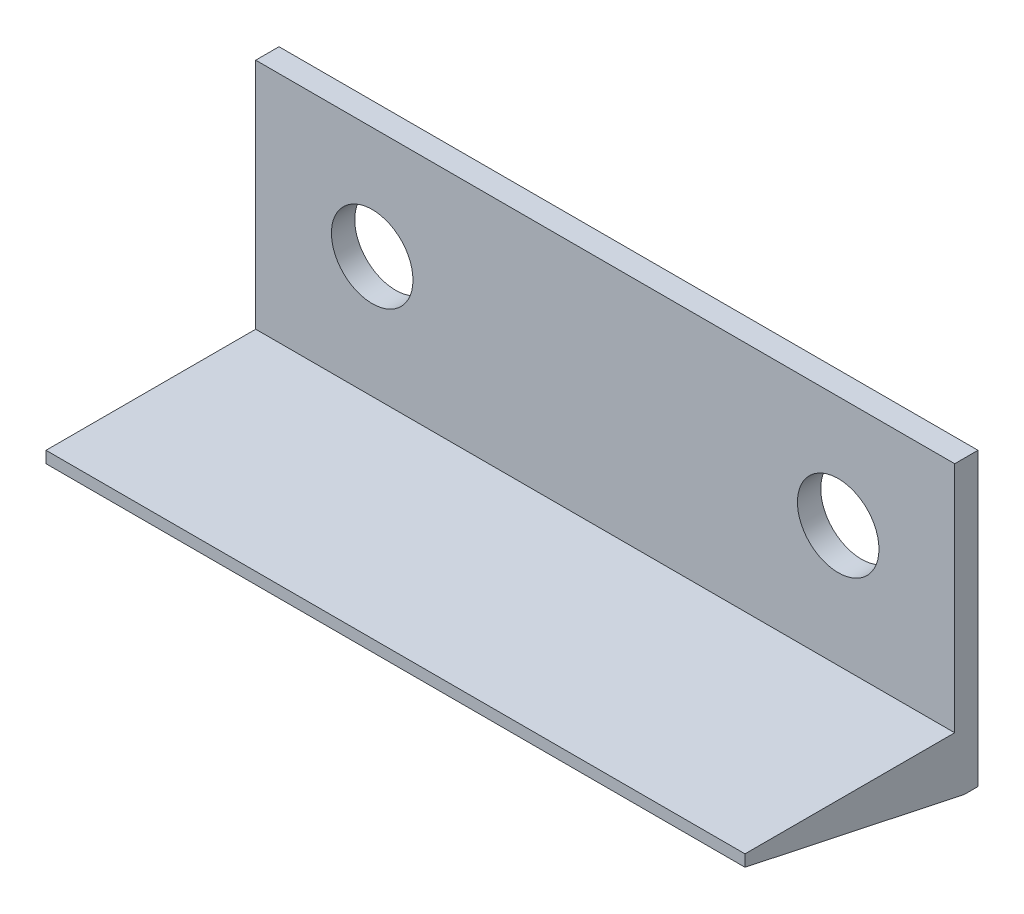
ISO-10303-21;
HEADER;
FILE_DESCRIPTION(('STEP AP214'),'2;1');
FILE_NAME('part.step','',(''),(''),'','','');
FILE_SCHEMA(('AUTOMOTIVE_DESIGN { 1 0 10303 214 1 1 1 1 }'));
ENDSEC;
DATA;
#1=APPLICATION_CONTEXT('core data for automotive mechanical design processes');
#2=APPLICATION_PROTOCOL_DEFINITION('international standard','automotive_design',2000,#1);
#3=PRODUCT_CONTEXT('',#1,'mechanical');
#4=PRODUCT('Part','Part','',(#3));
#5=PRODUCT_RELATED_PRODUCT_CATEGORY('part','',(#4));
#6=PRODUCT_DEFINITION_FORMATION('','',#4);
#7=PRODUCT_DEFINITION_CONTEXT('part definition',#1,'design');
#8=PRODUCT_DEFINITION('design','',#6,#7);
#9=PRODUCT_DEFINITION_SHAPE('','',#8);
#10=(LENGTH_UNIT() NAMED_UNIT(*) SI_UNIT(.MILLI.,.METRE.));
#11=(NAMED_UNIT(*) PLANE_ANGLE_UNIT() SI_UNIT($,.RADIAN.));
#12=(NAMED_UNIT(*) SI_UNIT($,.STERADIAN.) SOLID_ANGLE_UNIT());
#13=UNCERTAINTY_MEASURE_WITH_UNIT(LENGTH_MEASURE(1.E-05),#10,'distance_accuracy_value','');
#14=(GEOMETRIC_REPRESENTATION_CONTEXT(3) GLOBAL_UNCERTAINTY_ASSIGNED_CONTEXT((#13)) GLOBAL_UNIT_ASSIGNED_CONTEXT((#10,
#11,#12)) REPRESENTATION_CONTEXT('',''));
#15=CARTESIAN_POINT('',(0.,0.,0.));
#16=DIRECTION('',(0.,0.,1.));
#17=DIRECTION('',(1.,0.,0.));
#18=AXIS2_PLACEMENT_3D('',#15,#16,#17);
#19=CARTESIAN_POINT('',(0.,0.,1.));
#20=DIRECTION('',(0.,0.,1.));
#21=DIRECTION('',(1.,0.,0.));
#22=AXIS2_PLACEMENT_3D('',#19,#20,#21);
#23=PLANE('',#22);
#24=CARTESIAN_POINT('',(-10.,0.199999999999999,1.));
#25=DIRECTION('',(0.,0.,1.));
#26=DIRECTION('',(1.,0.,0.));
#27=AXIS2_PLACEMENT_3D('',#24,#25,#26);
#28=CIRCLE('',#27,1.75);
#29=CARTESIAN_POINT('',(-8.25,0.199999999999999,1.));
#30=VERTEX_POINT('',#29);
#31=EDGE_CURVE('E138',#30,#30,#28,.T.);
#32=ORIENTED_EDGE('',*,*,#31,.F.);
#33=EDGE_LOOP('',(#32));
#34=FACE_BOUND('',#33,.T.);
#35=DIRECTION('',(0.,1.,0.));
#36=VECTOR('',#35,1.);
#37=CARTESIAN_POINT('',(15.,5.,1.));
#38=LINE('',#37,#36);
#39=CARTESIAN_POINT('',(15.,-5.,1.));
#40=VERTEX_POINT('',#39);
#41=CARTESIAN_POINT('',(15.,5.,1.));
#42=VERTEX_POINT('',#41);
#43=EDGE_CURVE('E112',#40,#42,#38,.T.);
#44=ORIENTED_EDGE('',*,*,#43,.T.);
#45=DIRECTION('',(-1.,0.,0.));
#46=VECTOR('',#45,1.);
#47=CARTESIAN_POINT('',(-15.,5.,1.));
#48=LINE('',#47,#46);
#49=CARTESIAN_POINT('',(-15.,5.,1.));
#50=VERTEX_POINT('',#49);
#51=EDGE_CURVE('E145',#42,#50,#48,.T.);
#52=ORIENTED_EDGE('',*,*,#51,.T.);
#53=DIRECTION('',(0.,-1.,0.));
#54=VECTOR('',#53,1.);
#55=CARTESIAN_POINT('',(-15.,5.,1.));
#56=LINE('',#55,#54);
#57=CARTESIAN_POINT('',(-15.,-5.,1.));
#58=VERTEX_POINT('',#57);
#59=EDGE_CURVE('E148',#50,#58,#56,.T.);
#60=ORIENTED_EDGE('',*,*,#59,.T.);
#61=DIRECTION('',(1.,0.,0.));
#62=VECTOR('',#61,1.);
#63=CARTESIAN_POINT('',(-15.,-5.,1.));
#64=LINE('',#63,#62);
#65=EDGE_CURVE('E151',#58,#40,#64,.T.);
#66=ORIENTED_EDGE('',*,*,#65,.T.);
#67=EDGE_LOOP('',(#44,#52,#60,#66));
#68=FACE_BOUND('',#67,.T.);
#69=CARTESIAN_POINT('',(10.,0.199999999999999,1.));
#70=DIRECTION('',(0.,0.,1.));
#71=DIRECTION('',(1.,0.,0.));
#72=AXIS2_PLACEMENT_3D('',#69,#70,#71);
#73=CIRCLE('',#72,1.75);
#74=CARTESIAN_POINT('',(11.75,0.199999999999999,1.));
#75=VERTEX_POINT('',#74);
#76=EDGE_CURVE('E132',#75,#75,#73,.T.);
#77=ORIENTED_EDGE('',*,*,#76,.F.);
#78=EDGE_LOOP('',(#77));
#79=FACE_BOUND('',#78,.T.);
#80=ADVANCED_FACE('F39',(#34,#68,#79),#23,.T.);
#81=CARTESIAN_POINT('',(0.,0.,0.));
#82=DIRECTION('',(0.,0.,1.));
#83=DIRECTION('',(1.,0.,0.));
#84=AXIS2_PLACEMENT_3D('',#81,#82,#83);
#85=PLANE('',#84);
#86=DIRECTION('',(0.,1.,0.));
#87=VECTOR('',#86,1.);
#88=CARTESIAN_POINT('',(15.,5.,0.));
#89=LINE('',#88,#87);
#90=CARTESIAN_POINT('',(15.,-7.5,0.));
#91=VERTEX_POINT('',#90);
#92=CARTESIAN_POINT('',(15.,5.,0.));
#93=VERTEX_POINT('',#92);
#94=EDGE_CURVE('E141',#91,#93,#89,.T.);
#95=ORIENTED_EDGE('',*,*,#94,.F.);
#96=DIRECTION('',(1.,0.,0.));
#97=VECTOR('',#96,1.);
#98=CARTESIAN_POINT('',(-15.,-7.5,0.));
#99=LINE('',#98,#97);
#100=CARTESIAN_POINT('',(-15.,-7.5,0.));
#101=VERTEX_POINT('',#100);
#102=EDGE_CURVE('E125',#101,#91,#99,.T.);
#103=ORIENTED_EDGE('',*,*,#102,.F.);
#104=DIRECTION('',(0.,-1.,0.));
#105=VECTOR('',#104,1.);
#106=CARTESIAN_POINT('',(-15.,5.,0.));
#107=LINE('',#106,#105);
#108=CARTESIAN_POINT('',(-15.,5.,0.));
#109=VERTEX_POINT('',#108);
#110=EDGE_CURVE('E146',#109,#101,#107,.T.);
#111=ORIENTED_EDGE('',*,*,#110,.F.);
#112=DIRECTION('',(-1.,0.,0.));
#113=VECTOR('',#112,1.);
#114=CARTESIAN_POINT('',(-15.,5.,0.));
#115=LINE('',#114,#113);
#116=EDGE_CURVE('E156',#93,#109,#115,.T.);
#117=ORIENTED_EDGE('',*,*,#116,.F.);
#118=EDGE_LOOP('',(#95,#103,#111,#117));
#119=FACE_BOUND('',#118,.T.);
#120=CARTESIAN_POINT('',(-10.,0.199999999999999,0.));
#121=DIRECTION('',(0.,0.,1.));
#122=DIRECTION('',(1.,0.,0.));
#123=AXIS2_PLACEMENT_3D('',#120,#121,#122);
#124=CIRCLE('',#123,1.75);
#125=CARTESIAN_POINT('',(-8.25,0.199999999999999,0.));
#126=VERTEX_POINT('',#125);
#127=EDGE_CURVE('E135',#126,#126,#124,.T.);
#128=ORIENTED_EDGE('',*,*,#127,.T.);
#129=EDGE_LOOP('',(#128));
#130=FACE_BOUND('',#129,.T.);
#131=CARTESIAN_POINT('',(10.,0.199999999999999,0.));
#132=DIRECTION('',(0.,0.,1.));
#133=DIRECTION('',(1.,0.,0.));
#134=AXIS2_PLACEMENT_3D('',#131,#132,#133);
#135=CIRCLE('',#134,1.75);
#136=CARTESIAN_POINT('',(11.75,0.199999999999999,0.));
#137=VERTEX_POINT('',#136);
#138=EDGE_CURVE('E131',#137,#137,#135,.T.);
#139=ORIENTED_EDGE('',*,*,#138,.T.);
#140=EDGE_LOOP('',(#139));
#141=FACE_BOUND('',#140,.T.);
#142=ADVANCED_FACE('F172',(#119,#130,#141),#85,.F.);
#143=CARTESIAN_POINT('',(15.,5.,1.));
#144=DIRECTION('',(-1.,0.,0.));
#145=DIRECTION('',(0.,-1.,0.));
#146=AXIS2_PLACEMENT_3D('',#143,#144,#145);
#147=PLANE('',#146);
#148=DIRECTION('',(0.,1.,0.));
#149=VECTOR('',#148,1.);
#150=CARTESIAN_POINT('',(15.,-5.,10.));
#151=LINE('',#150,#149);
#152=CARTESIAN_POINT('',(15.,-5.5,10.));
#153=VERTEX_POINT('',#152);
#154=CARTESIAN_POINT('',(15.,-5.,10.));
#155=VERTEX_POINT('',#154);
#156=EDGE_CURVE('E96',#153,#155,#151,.T.);
#157=ORIENTED_EDGE('',*,*,#156,.F.);
#158=DIRECTION('',(0.,-0.20791169081776,-0.978147600733805));
#159=VECTOR('',#158,1.);
#160=CARTESIAN_POINT('',(15.,-5.5,10.));
#161=LINE('',#160,#159);
#162=CARTESIAN_POINT('',(15.,-7.5,0.590739781043133));
#163=VERTEX_POINT('',#162);
#164=EDGE_CURVE('E62',#153,#163,#161,.T.);
#165=ORIENTED_EDGE('',*,*,#164,.T.);
#166=DIRECTION('',(0.,0.,-1.));
#167=VECTOR('',#166,1.);
#168=CARTESIAN_POINT('',(15.,-7.5,10.));
#169=LINE('',#168,#167);
#170=EDGE_CURVE('E115',#163,#91,#169,.T.);
#171=ORIENTED_EDGE('',*,*,#170,.T.);
#172=ORIENTED_EDGE('',*,*,#94,.T.);
#173=DIRECTION('',(0.,0.,-1.));
#174=VECTOR('',#173,1.);
#175=CARTESIAN_POINT('',(15.,5.,1.));
#176=LINE('',#175,#174);
#177=EDGE_CURVE('E162',#42,#93,#176,.T.);
#178=ORIENTED_EDGE('',*,*,#177,.F.);
#179=ORIENTED_EDGE('',*,*,#43,.F.);
#180=DIRECTION('',(0.,0.,-1.));
#181=VECTOR('',#180,1.);
#182=CARTESIAN_POINT('',(15.,-5.,10.));
#183=LINE('',#182,#181);
#184=EDGE_CURVE('E108',#155,#40,#183,.T.);
#185=ORIENTED_EDGE('',*,*,#184,.F.);
#186=EDGE_LOOP('',(#157,#165,#171,#172,#178,#179,#185));
#187=FACE_BOUND('',#186,.T.);
#188=ADVANCED_FACE('F109',(#187),#147,.F.);
#189=CARTESIAN_POINT('',(-15.,5.,1.));
#190=DIRECTION('',(0.,-1.,0.));
#191=DIRECTION('',(0.,0.,-1.));
#192=AXIS2_PLACEMENT_3D('',#189,#190,#191);
#193=PLANE('',#192);
#194=ORIENTED_EDGE('',*,*,#116,.T.);
#195=DIRECTION('',(0.,0.,-1.));
#196=VECTOR('',#195,1.);
#197=CARTESIAN_POINT('',(-15.,5.,1.));
#198=LINE('',#197,#196);
#199=EDGE_CURVE('E153',#50,#109,#198,.T.);
#200=ORIENTED_EDGE('',*,*,#199,.F.);
#201=ORIENTED_EDGE('',*,*,#51,.F.);
#202=ORIENTED_EDGE('',*,*,#177,.T.);
#203=EDGE_LOOP('',(#194,#200,#201,#202));
#204=FACE_BOUND('',#203,.T.);
#205=ADVANCED_FACE('F167',(#204),#193,.F.);
#206=CARTESIAN_POINT('',(-15.,5.,1.));
#207=DIRECTION('',(1.,0.,0.));
#208=DIRECTION('',(0.,1.,0.));
#209=AXIS2_PLACEMENT_3D('',#206,#207,#208);
#210=PLANE('',#209);
#211=DIRECTION('',(0.,0.,-1.));
#212=VECTOR('',#211,1.);
#213=CARTESIAN_POINT('',(-15.,-7.5,10.));
#214=LINE('',#213,#212);
#215=CARTESIAN_POINT('',(-15.,-7.5,0.590739781043133));
#216=VERTEX_POINT('',#215);
#217=EDGE_CURVE('E129',#216,#101,#214,.T.);
#218=ORIENTED_EDGE('',*,*,#217,.F.);
#219=DIRECTION('',(0.,0.20791169081776,0.978147600733805));
#220=VECTOR('',#219,1.);
#221=CARTESIAN_POINT('',(-15.,-5.5,10.));
#222=LINE('',#221,#220);
#223=CARTESIAN_POINT('',(-15.,-5.5,10.));
#224=VERTEX_POINT('',#223);
#225=EDGE_CURVE('E11',#216,#224,#222,.T.);
#226=ORIENTED_EDGE('',*,*,#225,.T.);
#227=DIRECTION('',(0.,-1.,0.));
#228=VECTOR('',#227,1.);
#229=CARTESIAN_POINT('',(-15.,-5.,10.));
#230=LINE('',#229,#228);
#231=CARTESIAN_POINT('',(-15.,-5.,10.));
#232=VERTEX_POINT('',#231);
#233=EDGE_CURVE('E105',#232,#224,#230,.T.);
#234=ORIENTED_EDGE('',*,*,#233,.F.);
#235=DIRECTION('',(0.,0.,-1.));
#236=VECTOR('',#235,1.);
#237=CARTESIAN_POINT('',(-15.,-5.,10.));
#238=LINE('',#237,#236);
#239=EDGE_CURVE('E116',#232,#58,#238,.T.);
#240=ORIENTED_EDGE('',*,*,#239,.T.);
#241=ORIENTED_EDGE('',*,*,#59,.F.);
#242=ORIENTED_EDGE('',*,*,#199,.T.);
#243=ORIENTED_EDGE('',*,*,#110,.T.);
#244=EDGE_LOOP('',(#218,#226,#234,#240,#241,#242,#243));
#245=FACE_BOUND('',#244,.T.);
#246=ADVANCED_FACE('F178',(#245),#210,.F.);
#247=CARTESIAN_POINT('',(-10.,0.199999999999999,1.));
#248=DIRECTION('',(0.,0.,-1.));
#249=DIRECTION('',(-1.,0.,0.));
#250=AXIS2_PLACEMENT_3D('',#247,#248,#249);
#251=CYLINDRICAL_SURFACE('',#250,1.75);
#252=ORIENTED_EDGE('',*,*,#31,.T.);
#253=EDGE_LOOP('',(#252));
#254=FACE_BOUND('',#253,.T.);
#255=ORIENTED_EDGE('',*,*,#127,.F.);
#256=EDGE_LOOP('',(#255));
#257=FACE_BOUND('',#256,.T.);
#258=ADVANCED_FACE('F190',(#254,#257),#251,.F.);
#259=CARTESIAN_POINT('',(10.,0.199999999999999,1.));
#260=DIRECTION('',(0.,0.,-1.));
#261=DIRECTION('',(-1.,0.,0.));
#262=AXIS2_PLACEMENT_3D('',#259,#260,#261);
#263=CYLINDRICAL_SURFACE('',#262,1.75);
#264=ORIENTED_EDGE('',*,*,#76,.T.);
#265=EDGE_LOOP('',(#264));
#266=FACE_BOUND('',#265,.T.);
#267=ORIENTED_EDGE('',*,*,#138,.F.);
#268=EDGE_LOOP('',(#267));
#269=FACE_BOUND('',#268,.T.);
#270=ADVANCED_FACE('F187',(#266,#269),#263,.F.);
#271=CARTESIAN_POINT('',(-15.,-7.5,10.));
#272=DIRECTION('',(0.,1.,0.));
#273=DIRECTION('',(0.,0.,1.));
#274=AXIS2_PLACEMENT_3D('',#271,#272,#273);
#275=PLANE('',#274);
#276=ORIENTED_EDGE('',*,*,#170,.F.);
#277=DIRECTION('',(-1.,0.,0.));
#278=VECTOR('',#277,1.);
#279=CARTESIAN_POINT('',(-15.,-7.5,0.590739781043132));
#280=LINE('',#279,#278);
#281=EDGE_CURVE('E48',#163,#216,#280,.T.);
#282=ORIENTED_EDGE('',*,*,#281,.T.);
#283=ORIENTED_EDGE('',*,*,#217,.T.);
#284=ORIENTED_EDGE('',*,*,#102,.T.);
#285=EDGE_LOOP('',(#276,#282,#283,#284));
#286=FACE_BOUND('',#285,.T.);
#287=ADVANCED_FACE('F175',(#286),#275,.F.);
#288=CARTESIAN_POINT('',(-15.,-5.,10.));
#289=DIRECTION('',(0.,-1.,0.));
#290=DIRECTION('',(0.,0.,-1.));
#291=AXIS2_PLACEMENT_3D('',#288,#289,#290);
#292=PLANE('',#291);
#293=ORIENTED_EDGE('',*,*,#65,.F.);
#294=ORIENTED_EDGE('',*,*,#239,.F.);
#295=DIRECTION('',(-1.,0.,0.));
#296=VECTOR('',#295,1.);
#297=CARTESIAN_POINT('',(-15.,-5.,10.));
#298=LINE('',#297,#296);
#299=EDGE_CURVE('E101',#155,#232,#298,.T.);
#300=ORIENTED_EDGE('',*,*,#299,.F.);
#301=ORIENTED_EDGE('',*,*,#184,.T.);
#302=EDGE_LOOP('',(#293,#294,#300,#301));
#303=FACE_BOUND('',#302,.T.);
#304=ADVANCED_FACE('F118',(#303),#292,.F.);
#305=CARTESIAN_POINT('',(0.,0.,10.));
#306=DIRECTION('',(0.,0.,1.));
#307=DIRECTION('',(1.,0.,0.));
#308=AXIS2_PLACEMENT_3D('',#305,#306,#307);
#309=PLANE('',#308);
#310=ORIENTED_EDGE('',*,*,#233,.T.);
#311=DIRECTION('',(1.,0.,0.));
#312=VECTOR('',#311,1.);
#313=CARTESIAN_POINT('',(15.,-5.5,10.));
#314=LINE('',#313,#312);
#315=EDGE_CURVE('E104',#224,#153,#314,.T.);
#316=ORIENTED_EDGE('',*,*,#315,.T.);
#317=ORIENTED_EDGE('',*,*,#156,.T.);
#318=ORIENTED_EDGE('',*,*,#299,.T.);
#319=EDGE_LOOP('',(#310,#316,#317,#318));
#320=FACE_BOUND('',#319,.T.);
#321=ADVANCED_FACE('F99',(#320),#309,.T.);
#322=CARTESIAN_POINT('',(0.,-5.5,10.));
#323=DIRECTION('',(0.,-0.978147600733805,0.20791169081776));
#324=DIRECTION('',(-1.,0.,0.));
#325=AXIS2_PLACEMENT_3D('',#322,#323,#324);
#326=PLANE('',#325);
#327=ORIENTED_EDGE('',*,*,#225,.F.);
#328=ORIENTED_EDGE('',*,*,#281,.F.);
#329=ORIENTED_EDGE('',*,*,#164,.F.);
#330=ORIENTED_EDGE('',*,*,#315,.F.);
#331=EDGE_LOOP('',(#327,#328,#329,#330));
#332=FACE_BOUND('',#331,.T.);
#333=ADVANCED_FACE('F42',(#332),#326,.T.);
#334=CLOSED_SHELL('',(#80,#142,#188,#205,#246,#258,#270,#287,#304,#321,#333));
#335=MANIFOLD_SOLID_BREP('B2',#334);
#336=ADVANCED_BREP_SHAPE_REPRESENTATION('',(#18,#335),#14);
#337=SHAPE_DEFINITION_REPRESENTATION(#9,#336);
ENDSEC;
END-ISO-10303-21;
